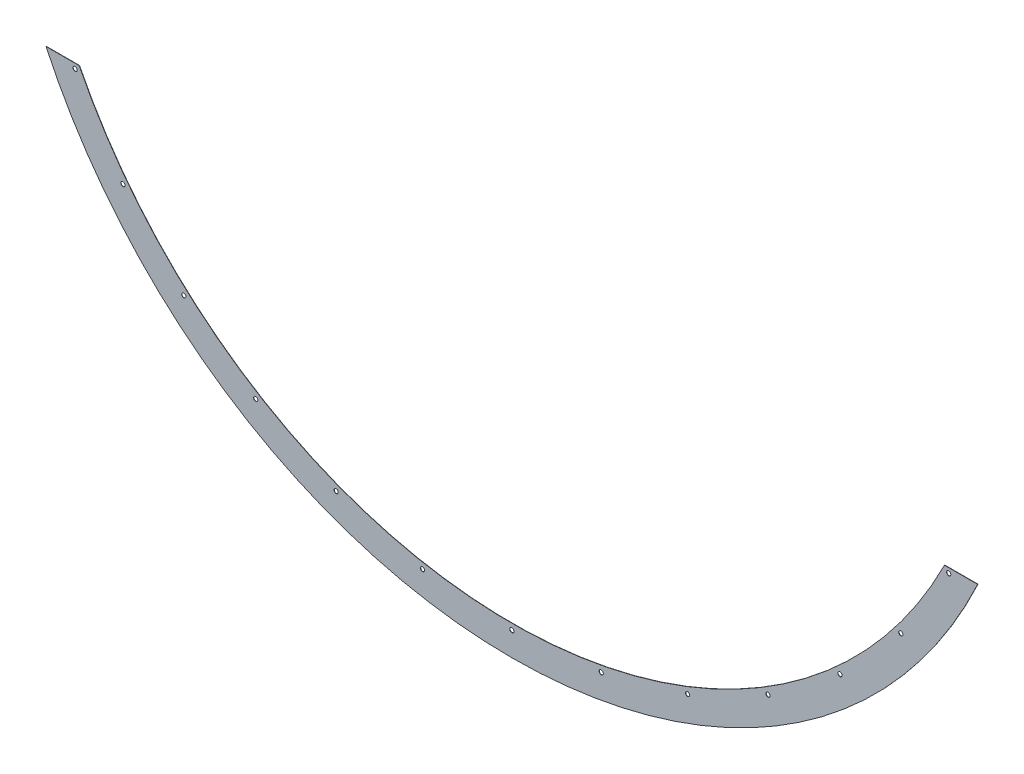
ISO-10303-21;
HEADER;
FILE_DESCRIPTION(('STEP AP214'),'2;1');
FILE_NAME('part.step','',(''),(''),'','','');
FILE_SCHEMA(('AUTOMOTIVE_DESIGN { 1 0 10303 214 1 1 1 1 }'));
ENDSEC;
DATA;
#1=APPLICATION_CONTEXT('core data for automotive mechanical design processes');
#2=APPLICATION_PROTOCOL_DEFINITION('international standard','automotive_design',2000,#1);
#3=PRODUCT_CONTEXT('',#1,'mechanical');
#4=PRODUCT('Part','Part','',(#3));
#5=PRODUCT_RELATED_PRODUCT_CATEGORY('part','',(#4));
#6=PRODUCT_DEFINITION_FORMATION('','',#4);
#7=PRODUCT_DEFINITION_CONTEXT('part definition',#1,'design');
#8=PRODUCT_DEFINITION('design','',#6,#7);
#9=PRODUCT_DEFINITION_SHAPE('','',#8);
#10=(LENGTH_UNIT() NAMED_UNIT(*) SI_UNIT(.MILLI.,.METRE.));
#11=(NAMED_UNIT(*) PLANE_ANGLE_UNIT() SI_UNIT($,.RADIAN.));
#12=(NAMED_UNIT(*) SI_UNIT($,.STERADIAN.) SOLID_ANGLE_UNIT());
#13=UNCERTAINTY_MEASURE_WITH_UNIT(LENGTH_MEASURE(1.E-05),#10,'distance_accuracy_value','');
#14=(GEOMETRIC_REPRESENTATION_CONTEXT(3) GLOBAL_UNCERTAINTY_ASSIGNED_CONTEXT((#13)) GLOBAL_UNIT_ASSIGNED_CONTEXT((#10,
#11,#12)) REPRESENTATION_CONTEXT('',''));
#15=CARTESIAN_POINT('',(0.,0.,0.));
#16=DIRECTION('',(0.,0.,1.));
#17=DIRECTION('',(1.,0.,0.));
#18=AXIS2_PLACEMENT_3D('',#15,#16,#17);
#19=CARTESIAN_POINT('',(0.,-364.000000000002,-1.11022302462516E-13));
#20=DIRECTION('',(0.,-1.00000000000001,0.));
#21=DIRECTION('',(1.,0.,0.));
#22=AXIS2_PLACEMENT_3D('',#19,#20,#21);
#23=PLANE('',#22);
#24=DIRECTION('',(0.,0.,1.00000000000001));
#25=VECTOR('',#24,1.);
#26=CARTESIAN_POINT('',(723.604864549706,-364.000000000002,-10.0000000000003));
#27=LINE('',#26,#25);
#28=CARTESIAN_POINT('',(723.604864549706,-364.000000000002,0.));
#29=VERTEX_POINT('',#28);
#30=CARTESIAN_POINT('',(723.604864549706,-364.000000000002,-0.500000000000334));
#31=VERTEX_POINT('',#30);
#32=EDGE_CURVE('E11',#29,#31,#27,.F.);
#33=ORIENTED_EDGE('',*,*,#32,.F.);
#34=DIRECTION('',(1.,0.,0.));
#35=VECTOR('',#34,1.);
#36=CARTESIAN_POINT('',(0.,-364.000000000002,-1.11022302462516E-13));
#37=LINE('',#36,#35);
#38=CARTESIAN_POINT('',(779.168787875899,-364.000000000002,0.));
#39=VERTEX_POINT('',#38);
#40=EDGE_CURVE('E89',#29,#39,#37,.T.);
#41=ORIENTED_EDGE('',*,*,#40,.T.);
#42=DIRECTION('',(0.,0.,1.00000000000001));
#43=VECTOR('',#42,1.);
#44=CARTESIAN_POINT('',(779.168787875899,-364.000000000002,0.));
#45=LINE('',#44,#43);
#46=CARTESIAN_POINT('',(779.168787875899,-364.000000000002,-0.499999999999834));
#47=VERTEX_POINT('',#46);
#48=EDGE_CURVE('E109',#39,#47,#45,.F.);
#49=ORIENTED_EDGE('',*,*,#48,.T.);
#50=DIRECTION('',(1.,0.,0.));
#51=VECTOR('',#50,1.);
#52=CARTESIAN_POINT('',(0.,-364.000000000002,-0.500000000000334));
#53=LINE('',#52,#51);
#54=EDGE_CURVE('E91',#31,#47,#53,.T.);
#55=ORIENTED_EDGE('',*,*,#54,.F.);
#56=EDGE_LOOP('',(#33,#41,#49,#55));
#57=FACE_BOUND('',#56,.T.);
#58=ADVANCED_FACE('F38',(#57),#23,.F.);
#59=CARTESIAN_POINT('',(0.,1.38777878078145E-13,-0.500000000000111));
#60=DIRECTION('',(0.,0.,1.00000000000001));
#61=DIRECTION('',(1.,0.,0.));
#62=AXIS2_PLACEMENT_3D('',#59,#60,#61);
#63=CYLINDRICAL_SURFACE('',#62,860.);
#64=CARTESIAN_POINT('',(0.,1.38777878078145E-13,-0.500000000000111));
#65=DIRECTION('',(0.,0.,1.00000000000001));
#66=DIRECTION('',(1.,0.,0.));
#67=AXIS2_PLACEMENT_3D('',#64,#65,#66);
#68=CIRCLE('',#67,860.);
#69=CARTESIAN_POINT('',(-779.168787875901,-364.000000000002,-0.5));
#70=VERTEX_POINT('',#69);
#71=EDGE_CURVE('E120',#70,#47,#68,.T.);
#72=ORIENTED_EDGE('',*,*,#71,.T.);
#73=ORIENTED_EDGE('',*,*,#48,.F.);
#74=CARTESIAN_POINT('',(0.,0.,0.));
#75=DIRECTION('',(0.,0.,1.00000000000001));
#76=DIRECTION('',(1.,0.,0.));
#77=AXIS2_PLACEMENT_3D('',#74,#75,#76);
#78=CIRCLE('',#77,860.);
#79=CARTESIAN_POINT('',(-779.168787875902,-364.000000000002,-1.66533453693773E-13));
#80=VERTEX_POINT('',#79);
#81=EDGE_CURVE('E95',#80,#39,#78,.T.);
#82=ORIENTED_EDGE('',*,*,#81,.F.);
#83=DIRECTION('',(0.,0.,1.00000000000001));
#84=VECTOR('',#83,1.);
#85=CARTESIAN_POINT('',(-779.168787875901,-364.000000000002,-1.66533453693773E-13));
#86=LINE('',#85,#84);
#87=EDGE_CURVE('E62',#80,#70,#86,.F.);
#88=ORIENTED_EDGE('',*,*,#87,.T.);
#89=EDGE_LOOP('',(#72,#73,#82,#88));
#90=FACE_BOUND('',#89,.T.);
#91=ADVANCED_FACE('F40',(#90),#63,.T.);
#92=CARTESIAN_POINT('',(0.,1.38777878078145E-13,-0.500000000000111));
#93=DIRECTION('',(0.,0.,1.00000000000001));
#94=DIRECTION('',(1.,0.,0.));
#95=AXIS2_PLACEMENT_3D('',#92,#93,#94);
#96=PLANE('',#95);
#97=CARTESIAN_POINT('',(293.861718627147,-765.53594972771,-0.500000000000111));
#98=DIRECTION('',(0.,0.,-1.00000000000001));
#99=DIRECTION('',(-0.933580426497202,-0.358367949545303,0.));
#100=AXIS2_PLACEMENT_3D('',#97,#98,#99);
#101=CIRCLE('',#100,3.5);
#102=CARTESIAN_POINT('',(290.594187134407,-766.790237551118,-0.500000000000111));
#103=VERTEX_POINT('',#102);
#104=EDGE_CURVE('E136',#103,#103,#101,.T.);
#105=ORIENTED_EDGE('',*,*,#104,.F.);
#106=EDGE_LOOP('',(#105));
#107=FACE_BOUND('',#106,.T.);
#108=CARTESIAN_POINT('',(428.448823067079,-699.16493477036,-0.499999999999889));
#109=DIRECTION('',(0.,0.,-1.00000000000001));
#110=DIRECTION('',(-0.852640164354092,-0.522498564715953,0.));
#111=AXIS2_PLACEMENT_3D('',#108,#109,#110);
#112=CIRCLE('',#111,3.5);
#113=CARTESIAN_POINT('',(425.46458249184,-700.993679746865,-0.49999999999989));
#114=VERTEX_POINT('',#113);
#115=EDGE_CURVE('E164',#114,#114,#112,.T.);
#116=ORIENTED_EDGE('',*,*,#115,.F.);
#117=EDGE_LOOP('',(#116));
#118=FACE_BOUND('',#117,.T.);
#119=CARTESIAN_POINT('',(548.687097214264,-609.378756891466,-0.500000000000222));
#120=DIRECTION('',(0.,0.,-1.00000000000001));
#121=DIRECTION('',(-0.743144825477393,-0.669130606358864,0.));
#122=AXIS2_PLACEMENT_3D('',#119,#120,#121);
#123=CIRCLE('',#122,3.5);
#124=CARTESIAN_POINT('',(546.086090325093,-611.720714013722,-0.500000000000223));
#125=VERTEX_POINT('',#124);
#126=EDGE_CURVE('E161',#125,#125,#123,.T.);
#127=ORIENTED_EDGE('',*,*,#126,.F.);
#128=EDGE_LOOP('',(#127));
#129=FACE_BOUND('',#128,.T.);
#130=CARTESIAN_POINT('',(650.549739038814,-499.184371787153,-0.500000000000056));
#131=DIRECTION('',(0.,0.,-1.00000000000001));
#132=DIRECTION('',(-0.608761429008719,-0.793353340291242,0.));
#133=AXIS2_PLACEMENT_3D('',#130,#131,#132);
#134=CIRCLE('',#133,3.5);
#135=CARTESIAN_POINT('',(648.419074037284,-501.961108478172,-0.500000000000057));
#136=VERTEX_POINT('',#135);
#137=EDGE_CURVE('E158',#136,#136,#134,.T.);
#138=ORIENTED_EDGE('',*,*,#137,.F.);
#139=EDGE_LOOP('',(#138));
#140=FACE_BOUND('',#139,.T.);
#141=CARTESIAN_POINT('',(730.625349834461,-372.272209786429,-0.500000000000334));
#142=DIRECTION('',(0.,0.,-1.00000000000001));
#143=DIRECTION('',(-0.453990499739545,-0.891006524188374,0.));
#144=AXIS2_PLACEMENT_3D('',#141,#142,#143);
#145=CIRCLE('',#144,3.5);
#146=CARTESIAN_POINT('',(729.036383085373,-375.390732621088,-0.500000000000334));
#147=VERTEX_POINT('',#146);
#148=EDGE_CURVE('E155',#147,#147,#145,.T.);
#149=ORIENTED_EDGE('',*,*,#148,.F.);
#150=EDGE_LOOP('',(#149));
#151=FACE_BOUND('',#150,.T.);
#152=CARTESIAN_POINT('',(-149.433130903561,-806.269024202448,-0.500000000000667));
#153=DIRECTION('',(0.,0.,-1.00000000000001));
#154=DIRECTION('',(-0.983254907563954,0.182235525492149,0.));
#155=AXIS2_PLACEMENT_3D('',#152,#153,#154);
#156=CIRCLE('',#155,3.5);
#157=CARTESIAN_POINT('',(-152.874523080035,-805.631199863226,-0.500000000000667));
#158=VERTEX_POINT('',#157);
#159=EDGE_CURVE('E152',#158,#158,#156,.T.);
#160=ORIENTED_EDGE('',*,*,#159,.F.);
#161=EDGE_LOOP('',(#160));
#162=FACE_BOUND('',#161,.T.);
#163=CARTESIAN_POINT('',(-293.861718627147,-765.535949727709,-0.5));
#164=DIRECTION('',(0.,0.,-1.00000000000001));
#165=DIRECTION('',(-0.933580426497201,0.358367949545303,0.));
#166=AXIS2_PLACEMENT_3D('',#163,#164,#165);
#167=CIRCLE('',#166,3.5);
#168=CARTESIAN_POINT('',(-297.129250119887,-764.281661904301,-0.500000000000001));
#169=VERTEX_POINT('',#168);
#170=EDGE_CURVE('E149',#169,#169,#167,.T.);
#171=ORIENTED_EDGE('',*,*,#170,.F.);
#172=EDGE_LOOP('',(#171));
#173=FACE_BOUND('',#172,.T.);
#174=CARTESIAN_POINT('',(-428.448823067079,-699.164934770359,-0.500000000000222));
#175=DIRECTION('',(0.,0.,-1.00000000000001));
#176=DIRECTION('',(-0.852640164354092,0.522498564715953,0.));
#177=AXIS2_PLACEMENT_3D('',#174,#175,#176);
#178=CIRCLE('',#177,3.5);
#179=CARTESIAN_POINT('',(-431.433063642318,-697.336189793853,-0.500000000000222));
#180=VERTEX_POINT('',#179);
#181=EDGE_CURVE('E146',#180,#180,#178,.T.);
#182=ORIENTED_EDGE('',*,*,#181,.F.);
#183=EDGE_LOOP('',(#182));
#184=FACE_BOUND('',#183,.T.);
#185=CARTESIAN_POINT('',(-548.687097214265,-609.378756891467,-0.500000000000556));
#186=DIRECTION('',(0.,0.,-1.00000000000001));
#187=DIRECTION('',(-0.743144825477393,0.669130606358864,0.));
#188=AXIS2_PLACEMENT_3D('',#185,#186,#187);
#189=CIRCLE('',#188,3.5);
#190=CARTESIAN_POINT('',(-551.288104103436,-607.036799769211,-0.500000000000556));
#191=VERTEX_POINT('',#190);
#192=EDGE_CURVE('E143',#191,#191,#189,.T.);
#193=ORIENTED_EDGE('',*,*,#192,.F.);
#194=EDGE_LOOP('',(#193));
#195=FACE_BOUND('',#194,.T.);
#196=CARTESIAN_POINT('',(-650.549739038814,-499.184371787153,-0.499999999999889));
#197=DIRECTION('',(0.,0.,-1.00000000000001));
#198=DIRECTION('',(-0.608761429008719,0.793353340291242,0.));
#199=AXIS2_PLACEMENT_3D('',#196,#197,#198);
#200=CIRCLE('',#199,3.5);
#201=CARTESIAN_POINT('',(-652.680404040344,-496.407635096133,-0.499999999999891));
#202=VERTEX_POINT('',#201);
#203=EDGE_CURVE('E140',#202,#202,#200,.T.);
#204=ORIENTED_EDGE('',*,*,#203,.F.);
#205=EDGE_LOOP('',(#204));
#206=FACE_BOUND('',#205,.T.);
#207=CARTESIAN_POINT('',(-730.625349834464,-372.272209786429,-0.5000000000005));
#208=DIRECTION('',(0.,0.,-1.00000000000001));
#209=DIRECTION('',(-0.453990499739545,0.891006524188374,0.));
#210=AXIS2_PLACEMENT_3D('',#207,#208,#209);
#211=CIRCLE('',#210,3.5);
#212=CARTESIAN_POINT('',(-732.214316583552,-369.153686951769,-0.5000000000005));
#213=VERTEX_POINT('',#212);
#214=EDGE_CURVE('E137',#213,#213,#211,.T.);
#215=ORIENTED_EDGE('',*,*,#214,.F.);
#216=EDGE_LOOP('',(#215));
#217=FACE_BOUND('',#216,.T.);
#218=CARTESIAN_POINT('',(149.433130903561,-806.269024202448,-0.499999999999445));
#219=DIRECTION('',(0.,0.,-1.00000000000001));
#220=DIRECTION('',(-0.983254907563955,-0.182235525492149,0.));
#221=AXIS2_PLACEMENT_3D('',#218,#219,#220);
#222=CIRCLE('',#221,3.5);
#223=CARTESIAN_POINT('',(145.991738727087,-806.90684854167,-0.499999999999446));
#224=VERTEX_POINT('',#223);
#225=EDGE_CURVE('E132',#224,#224,#222,.T.);
#226=ORIENTED_EDGE('',*,*,#225,.F.);
#227=EDGE_LOOP('',(#226));
#228=FACE_BOUND('',#227,.T.);
#229=CARTESIAN_POINT('',(0.,-820.000000000005,-0.499999999999723));
#230=DIRECTION('',(0.,0.,-1.00000000000001));
#231=DIRECTION('',(-1.,0.,0.));
#232=AXIS2_PLACEMENT_3D('',#229,#230,#231);
#233=CIRCLE('',#232,3.5);
#234=CARTESIAN_POINT('',(-3.50000000000001,-820.000000000005,-0.499999999999723));
#235=VERTEX_POINT('',#234);
#236=EDGE_CURVE('E129',#235,#235,#233,.T.);
#237=ORIENTED_EDGE('',*,*,#236,.F.);
#238=EDGE_LOOP('',(#237));
#239=FACE_BOUND('',#238,.T.);
#240=CARTESIAN_POINT('',(-723.604864549708,-364.000000000002,-0.500000000000667));
#241=VERTEX_POINT('',#240);
#242=EDGE_CURVE('E113',#70,#241,#53,.T.);
#243=ORIENTED_EDGE('',*,*,#242,.T.);
#244=CARTESIAN_POINT('',(0.,1.38777878078145E-13,-0.500000000000111));
#245=DIRECTION('',(0.,0.,1.00000000000001));
#246=DIRECTION('',(1.,0.,0.));
#247=AXIS2_PLACEMENT_3D('',#244,#245,#246);
#248=CIRCLE('',#247,810.);
#249=EDGE_CURVE('E54',#241,#31,#248,.T.);
#250=ORIENTED_EDGE('',*,*,#249,.T.);
#251=ORIENTED_EDGE('',*,*,#54,.T.);
#252=ORIENTED_EDGE('',*,*,#71,.F.);
#253=EDGE_LOOP('',(#243,#250,#251,#252));
#254=FACE_BOUND('',#253,.T.);
#255=ADVANCED_FACE('F118',(#107,#118,#129,#140,#151,#162,#173,#184,#195,#206,#217,#228,#239,
#254),#96,.F.);
#256=CARTESIAN_POINT('',(0.,0.,0.));
#257=DIRECTION('',(0.,0.,1.00000000000001));
#258=DIRECTION('',(1.,0.,0.));
#259=AXIS2_PLACEMENT_3D('',#256,#257,#258);
#260=PLANE('',#259);
#261=CARTESIAN_POINT('',(293.861718627147,-765.53594972771,0.));
#262=DIRECTION('',(0.,0.,1.00000000000001));
#263=DIRECTION('',(1.,0.,0.));
#264=AXIS2_PLACEMENT_3D('',#261,#262,#263);
#265=CIRCLE('',#264,3.5);
#266=CARTESIAN_POINT('',(297.361718627147,-765.53594972771,0.));
#267=VERTEX_POINT('',#266);
#268=EDGE_CURVE('E42',#267,#267,#265,.T.);
#269=ORIENTED_EDGE('',*,*,#268,.F.);
#270=EDGE_LOOP('',(#269));
#271=FACE_BOUND('',#270,.T.);
#272=CARTESIAN_POINT('',(428.448823067079,-699.16493477036,0.));
#273=DIRECTION('',(0.,0.,1.00000000000001));
#274=DIRECTION('',(1.,0.,0.));
#275=AXIS2_PLACEMENT_3D('',#272,#273,#274);
#276=CIRCLE('',#275,3.5);
#277=CARTESIAN_POINT('',(431.948823067079,-699.16493477036,0.));
#278=VERTEX_POINT('',#277);
#279=EDGE_CURVE('E232',#278,#278,#276,.T.);
#280=ORIENTED_EDGE('',*,*,#279,.F.);
#281=EDGE_LOOP('',(#280));
#282=FACE_BOUND('',#281,.T.);
#283=CARTESIAN_POINT('',(548.687097214264,-609.378756891467,-3.33066907387547E-13));
#284=DIRECTION('',(0.,0.,1.00000000000001));
#285=DIRECTION('',(1.,0.,0.));
#286=AXIS2_PLACEMENT_3D('',#283,#284,#285);
#287=CIRCLE('',#286,3.5);
#288=CARTESIAN_POINT('',(552.187097214264,-609.378756891467,-3.33066907387547E-13));
#289=VERTEX_POINT('',#288);
#290=EDGE_CURVE('E236',#289,#289,#287,.T.);
#291=ORIENTED_EDGE('',*,*,#290,.F.);
#292=EDGE_LOOP('',(#291));
#293=FACE_BOUND('',#292,.T.);
#294=CARTESIAN_POINT('',(650.549739038814,-499.184371787153,1.66533453693773E-13));
#295=DIRECTION('',(0.,0.,1.00000000000001));
#296=DIRECTION('',(1.,0.,0.));
#297=AXIS2_PLACEMENT_3D('',#294,#295,#296);
#298=CIRCLE('',#297,3.5);
#299=CARTESIAN_POINT('',(654.049739038814,-499.184371787153,1.66533453693773E-13));
#300=VERTEX_POINT('',#299);
#301=EDGE_CURVE('E240',#300,#300,#298,.T.);
#302=ORIENTED_EDGE('',*,*,#301,.F.);
#303=EDGE_LOOP('',(#302));
#304=FACE_BOUND('',#303,.T.);
#305=CARTESIAN_POINT('',(730.625349834461,-372.272209786429,-6.10622663543836E-13));
#306=DIRECTION('',(0.,0.,1.00000000000001));
#307=DIRECTION('',(1.,0.,0.));
#308=AXIS2_PLACEMENT_3D('',#305,#306,#307);
#309=CIRCLE('',#308,3.5);
#310=CARTESIAN_POINT('',(734.125349834461,-372.272209786429,-6.10622663543836E-13));
#311=VERTEX_POINT('',#310);
#312=EDGE_CURVE('E244',#311,#311,#309,.T.);
#313=ORIENTED_EDGE('',*,*,#312,.F.);
#314=EDGE_LOOP('',(#313));
#315=FACE_BOUND('',#314,.T.);
#316=CARTESIAN_POINT('',(-149.433130903561,-806.269024202448,-7.21644966006352E-13));
#317=DIRECTION('',(0.,0.,1.00000000000001));
#318=DIRECTION('',(1.,0.,0.));
#319=AXIS2_PLACEMENT_3D('',#316,#317,#318);
#320=CIRCLE('',#319,3.5);
#321=CARTESIAN_POINT('',(-145.933130903561,-806.269024202448,-7.21644966006352E-13));
#322=VERTEX_POINT('',#321);
#323=EDGE_CURVE('E248',#322,#322,#320,.T.);
#324=ORIENTED_EDGE('',*,*,#323,.F.);
#325=EDGE_LOOP('',(#324));
#326=FACE_BOUND('',#325,.T.);
#327=CARTESIAN_POINT('',(-293.861718627147,-765.535949727709,0.));
#328=DIRECTION('',(0.,0.,1.00000000000001));
#329=DIRECTION('',(1.,0.,0.));
#330=AXIS2_PLACEMENT_3D('',#327,#328,#329);
#331=CIRCLE('',#330,3.5);
#332=CARTESIAN_POINT('',(-290.361718627147,-765.535949727709,0.));
#333=VERTEX_POINT('',#332);
#334=EDGE_CURVE('E252',#333,#333,#331,.T.);
#335=ORIENTED_EDGE('',*,*,#334,.F.);
#336=EDGE_LOOP('',(#335));
#337=FACE_BOUND('',#336,.T.);
#338=CARTESIAN_POINT('',(-428.448823067079,-699.16493477036,0.));
#339=DIRECTION('',(0.,0.,1.00000000000001));
#340=DIRECTION('',(1.,0.,0.));
#341=AXIS2_PLACEMENT_3D('',#338,#339,#340);
#342=CIRCLE('',#341,3.5);
#343=CARTESIAN_POINT('',(-424.948823067079,-699.16493477036,0.));
#344=VERTEX_POINT('',#343);
#345=EDGE_CURVE('E256',#344,#344,#342,.T.);
#346=ORIENTED_EDGE('',*,*,#345,.F.);
#347=EDGE_LOOP('',(#346));
#348=FACE_BOUND('',#347,.T.);
#349=CARTESIAN_POINT('',(-548.687097214265,-609.378756891466,-4.9960036108132E-13));
#350=DIRECTION('',(0.,0.,1.00000000000001));
#351=DIRECTION('',(1.,0.,0.));
#352=AXIS2_PLACEMENT_3D('',#349,#350,#351);
#353=CIRCLE('',#352,3.5);
#354=CARTESIAN_POINT('',(-545.187097214265,-609.378756891466,-4.9960036108132E-13));
#355=VERTEX_POINT('',#354);
#356=EDGE_CURVE('E260',#355,#355,#353,.T.);
#357=ORIENTED_EDGE('',*,*,#356,.F.);
#358=EDGE_LOOP('',(#357));
#359=FACE_BOUND('',#358,.T.);
#360=CARTESIAN_POINT('',(-650.549739038814,-499.184371787153,3.88578058618805E-13));
#361=DIRECTION('',(0.,0.,1.00000000000001));
#362=DIRECTION('',(1.,0.,0.));
#363=AXIS2_PLACEMENT_3D('',#360,#361,#362);
#364=CIRCLE('',#363,3.5);
#365=CARTESIAN_POINT('',(-647.049739038814,-499.184371787153,3.88578058618805E-13));
#366=VERTEX_POINT('',#365);
#367=EDGE_CURVE('E264',#366,#366,#364,.T.);
#368=ORIENTED_EDGE('',*,*,#367,.F.);
#369=EDGE_LOOP('',(#368));
#370=FACE_BOUND('',#369,.T.);
#371=CARTESIAN_POINT('',(-730.625349834464,-372.272209786429,-3.88578058618805E-13));
#372=DIRECTION('',(0.,0.,1.00000000000001));
#373=DIRECTION('',(1.,0.,0.));
#374=AXIS2_PLACEMENT_3D('',#371,#372,#373);
#375=CIRCLE('',#374,3.5);
#376=CARTESIAN_POINT('',(-727.125349834464,-372.272209786429,-3.88578058618805E-13));
#377=VERTEX_POINT('',#376);
#378=EDGE_CURVE('E268',#377,#377,#375,.T.);
#379=ORIENTED_EDGE('',*,*,#378,.F.);
#380=EDGE_LOOP('',(#379));
#381=FACE_BOUND('',#380,.T.);
#382=CARTESIAN_POINT('',(149.433130903561,-806.269024202448,3.33066907387547E-13));
#383=DIRECTION('',(0.,0.,1.00000000000001));
#384=DIRECTION('',(1.,0.,0.));
#385=AXIS2_PLACEMENT_3D('',#382,#383,#384);
#386=CIRCLE('',#385,3.5);
#387=CARTESIAN_POINT('',(152.933130903561,-806.269024202448,3.33066907387547E-13));
#388=VERTEX_POINT('',#387);
#389=EDGE_CURVE('E135',#388,#388,#386,.T.);
#390=ORIENTED_EDGE('',*,*,#389,.F.);
#391=EDGE_LOOP('',(#390));
#392=FACE_BOUND('',#391,.T.);
#393=CARTESIAN_POINT('',(0.,-820.000000000005,-1.66533453693773E-13));
#394=DIRECTION('',(0.,0.,1.00000000000001));
#395=DIRECTION('',(1.,0.,0.));
#396=AXIS2_PLACEMENT_3D('',#393,#394,#395);
#397=CIRCLE('',#396,3.5);
#398=CARTESIAN_POINT('',(3.5,-820.000000000005,-1.66533453693773E-13));
#399=VERTEX_POINT('',#398);
#400=EDGE_CURVE('E84',#399,#399,#397,.T.);
#401=ORIENTED_EDGE('',*,*,#400,.F.);
#402=EDGE_LOOP('',(#401));
#403=FACE_BOUND('',#402,.T.);
#404=CARTESIAN_POINT('',(0.,0.,0.));
#405=DIRECTION('',(0.,0.,1.00000000000001));
#406=DIRECTION('',(1.,0.,0.));
#407=AXIS2_PLACEMENT_3D('',#404,#405,#406);
#408=CIRCLE('',#407,810.);
#409=CARTESIAN_POINT('',(-723.604864549708,-364.000000000002,-6.66133814775094E-13));
#410=VERTEX_POINT('',#409);
#411=EDGE_CURVE('E79',#410,#29,#408,.T.);
#412=ORIENTED_EDGE('',*,*,#411,.F.);
#413=EDGE_CURVE('E96',#80,#410,#37,.T.);
#414=ORIENTED_EDGE('',*,*,#413,.F.);
#415=ORIENTED_EDGE('',*,*,#81,.T.);
#416=ORIENTED_EDGE('',*,*,#40,.F.);
#417=EDGE_LOOP('',(#412,#414,#415,#416));
#418=FACE_BOUND('',#417,.T.);
#419=ADVANCED_FACE('F93',(#271,#282,#293,#304,#315,#326,#337,#348,#359,#370,#381,#392,#403,
#418),#260,.T.);
#420=DIRECTION('',(0.,0.,1.00000000000001));
#421=VECTOR('',#420,1.);
#422=CARTESIAN_POINT('',(-723.604864549709,-364.000000000002,-10.0000000000006));
#423=LINE('',#422,#421);
#424=EDGE_CURVE('E47',#241,#410,#423,.T.);
#425=ORIENTED_EDGE('',*,*,#424,.F.);
#426=ORIENTED_EDGE('',*,*,#242,.F.);
#427=ORIENTED_EDGE('',*,*,#87,.F.);
#428=ORIENTED_EDGE('',*,*,#413,.T.);
#429=EDGE_LOOP('',(#425,#426,#427,#428));
#430=FACE_BOUND('',#429,.T.);
#431=ADVANCED_FACE('F211',(#430),#23,.F.);
#432=CARTESIAN_POINT('',(0.,0.,-10.0000000000003));
#433=DIRECTION('',(0.,0.,1.00000000000001));
#434=DIRECTION('',(1.,0.,0.));
#435=AXIS2_PLACEMENT_3D('',#432,#433,#434);
#436=CYLINDRICAL_SURFACE('',#435,810.);
#437=ORIENTED_EDGE('',*,*,#424,.T.);
#438=ORIENTED_EDGE('',*,*,#411,.T.);
#439=ORIENTED_EDGE('',*,*,#32,.T.);
#440=ORIENTED_EDGE('',*,*,#249,.F.);
#441=EDGE_LOOP('',(#437,#438,#439,#440));
#442=FACE_BOUND('',#441,.T.);
#443=ADVANCED_FACE('F81',(#442),#436,.F.);
#444=CARTESIAN_POINT('',(0.,-820.000000000005,9.49999999999976));
#445=DIRECTION('',(0.,0.,-1.00000000000001));
#446=DIRECTION('',(-1.,0.,0.));
#447=AXIS2_PLACEMENT_3D('',#444,#445,#446);
#448=CYLINDRICAL_SURFACE('',#447,3.5);
#449=ORIENTED_EDGE('',*,*,#400,.T.);
#450=EDGE_LOOP('',(#449));
#451=FACE_BOUND('',#450,.T.);
#452=ORIENTED_EDGE('',*,*,#236,.T.);
#453=EDGE_LOOP('',(#452));
#454=FACE_BOUND('',#453,.T.);
#455=ADVANCED_FACE('F199',(#451,#454),#448,.F.);
#456=CARTESIAN_POINT('',(149.433130903561,-806.269024202448,9.49999999999965));
#457=DIRECTION('',(0.,0.,-1.00000000000001));
#458=DIRECTION('',(-1.,0.,0.));
#459=AXIS2_PLACEMENT_3D('',#456,#457,#458);
#460=CYLINDRICAL_SURFACE('',#459,3.5);
#461=ORIENTED_EDGE('',*,*,#389,.T.);
#462=EDGE_LOOP('',(#461));
#463=FACE_BOUND('',#462,.T.);
#464=ORIENTED_EDGE('',*,*,#225,.T.);
#465=EDGE_LOOP('',(#464));
#466=FACE_BOUND('',#465,.T.);
#467=ADVANCED_FACE('F201',(#463,#466),#460,.F.);
#468=CARTESIAN_POINT('',(-730.625349834464,-372.272209786429,9.49999999999965));
#469=DIRECTION('',(0.,0.,-1.00000000000001));
#470=DIRECTION('',(-1.,0.,0.));
#471=AXIS2_PLACEMENT_3D('',#468,#469,#470);
#472=CYLINDRICAL_SURFACE('',#471,3.5);
#473=ORIENTED_EDGE('',*,*,#378,.T.);
#474=EDGE_LOOP('',(#473));
#475=FACE_BOUND('',#474,.T.);
#476=ORIENTED_EDGE('',*,*,#214,.T.);
#477=EDGE_LOOP('',(#476));
#478=FACE_BOUND('',#477,.T.);
#479=ADVANCED_FACE('F208',(#475,#478),#472,.F.);
#480=CARTESIAN_POINT('',(-650.549739038814,-499.184371787153,9.50000000000012));
#481=DIRECTION('',(0.,0.,-1.00000000000001));
#482=DIRECTION('',(-1.,0.,0.));
#483=AXIS2_PLACEMENT_3D('',#480,#481,#482);
#484=CYLINDRICAL_SURFACE('',#483,3.5);
#485=ORIENTED_EDGE('',*,*,#367,.T.);
#486=EDGE_LOOP('',(#485));
#487=FACE_BOUND('',#486,.T.);
#488=ORIENTED_EDGE('',*,*,#203,.T.);
#489=EDGE_LOOP('',(#488));
#490=FACE_BOUND('',#489,.T.);
#491=ADVANCED_FACE('F321',(#487,#490),#484,.F.);
#492=CARTESIAN_POINT('',(-548.687097214265,-609.378756891466,9.49999999999993));
#493=DIRECTION('',(0.,0.,-1.00000000000001));
#494=DIRECTION('',(-1.,0.,0.));
#495=AXIS2_PLACEMENT_3D('',#492,#493,#494);
#496=CYLINDRICAL_SURFACE('',#495,3.5);
#497=ORIENTED_EDGE('',*,*,#356,.T.);
#498=EDGE_LOOP('',(#497));
#499=FACE_BOUND('',#498,.T.);
#500=ORIENTED_EDGE('',*,*,#192,.T.);
#501=EDGE_LOOP('',(#500));
#502=FACE_BOUND('',#501,.T.);
#503=ADVANCED_FACE('F317',(#499,#502),#496,.F.);
#504=CARTESIAN_POINT('',(-428.448823067079,-699.16493477036,9.4999999999999));
#505=DIRECTION('',(0.,0.,-1.00000000000001));
#506=DIRECTION('',(-1.,0.,0.));
#507=AXIS2_PLACEMENT_3D('',#504,#505,#506);
#508=CYLINDRICAL_SURFACE('',#507,3.5);
#509=ORIENTED_EDGE('',*,*,#345,.T.);
#510=EDGE_LOOP('',(#509));
#511=FACE_BOUND('',#510,.T.);
#512=ORIENTED_EDGE('',*,*,#181,.T.);
#513=EDGE_LOOP('',(#512));
#514=FACE_BOUND('',#513,.T.);
#515=ADVANCED_FACE('F313',(#511,#514),#508,.F.);
#516=CARTESIAN_POINT('',(-293.861718627147,-765.53594972771,9.49999999999981));
#517=DIRECTION('',(0.,0.,-1.00000000000001));
#518=DIRECTION('',(-1.,0.,0.));
#519=AXIS2_PLACEMENT_3D('',#516,#517,#518);
#520=CYLINDRICAL_SURFACE('',#519,3.5);
#521=ORIENTED_EDGE('',*,*,#334,.T.);
#522=EDGE_LOOP('',(#521));
#523=FACE_BOUND('',#522,.T.);
#524=ORIENTED_EDGE('',*,*,#170,.T.);
#525=EDGE_LOOP('',(#524));
#526=FACE_BOUND('',#525,.T.);
#527=ADVANCED_FACE('F309',(#523,#526),#520,.F.);
#528=CARTESIAN_POINT('',(-149.433130903561,-806.269024202448,9.4999999999994));
#529=DIRECTION('',(0.,0.,-1.00000000000001));
#530=DIRECTION('',(-1.,0.,0.));
#531=AXIS2_PLACEMENT_3D('',#528,#529,#530);
#532=CYLINDRICAL_SURFACE('',#531,3.5);
#533=ORIENTED_EDGE('',*,*,#323,.T.);
#534=EDGE_LOOP('',(#533));
#535=FACE_BOUND('',#534,.T.);
#536=ORIENTED_EDGE('',*,*,#159,.T.);
#537=EDGE_LOOP('',(#536));
#538=FACE_BOUND('',#537,.T.);
#539=ADVANCED_FACE('F305',(#535,#538),#532,.F.);
#540=CARTESIAN_POINT('',(730.625349834461,-372.272209786429,9.49999999999959));
#541=DIRECTION('',(0.,0.,-1.00000000000001));
#542=DIRECTION('',(-1.,0.,0.));
#543=AXIS2_PLACEMENT_3D('',#540,#541,#542);
#544=CYLINDRICAL_SURFACE('',#543,3.5);
#545=ORIENTED_EDGE('',*,*,#312,.T.);
#546=EDGE_LOOP('',(#545));
#547=FACE_BOUND('',#546,.T.);
#548=ORIENTED_EDGE('',*,*,#148,.T.);
#549=EDGE_LOOP('',(#548));
#550=FACE_BOUND('',#549,.T.);
#551=ADVANCED_FACE('F301',(#547,#550),#544,.F.);
#552=CARTESIAN_POINT('',(650.549739038814,-499.184371787153,9.49999999999973));
#553=DIRECTION('',(0.,0.,-1.00000000000001));
#554=DIRECTION('',(-1.,0.,0.));
#555=AXIS2_PLACEMENT_3D('',#552,#553,#554);
#556=CYLINDRICAL_SURFACE('',#555,3.5);
#557=ORIENTED_EDGE('',*,*,#301,.T.);
#558=EDGE_LOOP('',(#557));
#559=FACE_BOUND('',#558,.T.);
#560=ORIENTED_EDGE('',*,*,#137,.T.);
#561=EDGE_LOOP('',(#560));
#562=FACE_BOUND('',#561,.T.);
#563=ADVANCED_FACE('F297',(#559,#562),#556,.F.);
#564=CARTESIAN_POINT('',(548.687097214264,-609.378756891466,9.49999999999979));
#565=DIRECTION('',(0.,0.,-1.00000000000001));
#566=DIRECTION('',(-1.,0.,0.));
#567=AXIS2_PLACEMENT_3D('',#564,#565,#566);
#568=CYLINDRICAL_SURFACE('',#567,3.5);
#569=ORIENTED_EDGE('',*,*,#290,.T.);
#570=EDGE_LOOP('',(#569));
#571=FACE_BOUND('',#570,.T.);
#572=ORIENTED_EDGE('',*,*,#126,.T.);
#573=EDGE_LOOP('',(#572));
#574=FACE_BOUND('',#573,.T.);
#575=ADVANCED_FACE('F292',(#571,#574),#568,.F.);
#576=CARTESIAN_POINT('',(428.448823067079,-699.16493477036,9.49999999999962));
#577=DIRECTION('',(0.,0.,-1.00000000000001));
#578=DIRECTION('',(-1.,0.,0.));
#579=AXIS2_PLACEMENT_3D('',#576,#577,#578);
#580=CYLINDRICAL_SURFACE('',#579,3.5);
#581=ORIENTED_EDGE('',*,*,#279,.T.);
#582=EDGE_LOOP('',(#581));
#583=FACE_BOUND('',#582,.T.);
#584=ORIENTED_EDGE('',*,*,#115,.T.);
#585=EDGE_LOOP('',(#584));
#586=FACE_BOUND('',#585,.T.);
#587=ADVANCED_FACE('F287',(#583,#586),#580,.F.);
#588=CARTESIAN_POINT('',(293.861718627147,-765.53594972771,9.4999999999999));
#589=DIRECTION('',(0.,0.,-1.00000000000001));
#590=DIRECTION('',(-1.,0.,0.));
#591=AXIS2_PLACEMENT_3D('',#588,#589,#590);
#592=CYLINDRICAL_SURFACE('',#591,3.5);
#593=ORIENTED_EDGE('',*,*,#268,.T.);
#594=EDGE_LOOP('',(#593));
#595=FACE_BOUND('',#594,.T.);
#596=ORIENTED_EDGE('',*,*,#104,.T.);
#597=EDGE_LOOP('',(#596));
#598=FACE_BOUND('',#597,.T.);
#599=ADVANCED_FACE('F170',(#595,#598),#592,.F.);
#600=CLOSED_SHELL('',(#58,#91,#255,#419,#431,#443,#455,#467,#479,#491,#503,#515,#527,#539,#551,
#563,#575,#587,#599));
#601=MANIFOLD_SOLID_BREP('B2',#600);
#602=ADVANCED_BREP_SHAPE_REPRESENTATION('',(#18,#601),#14);
#603=SHAPE_DEFINITION_REPRESENTATION(#9,#602);
ENDSEC;
END-ISO-10303-21;
